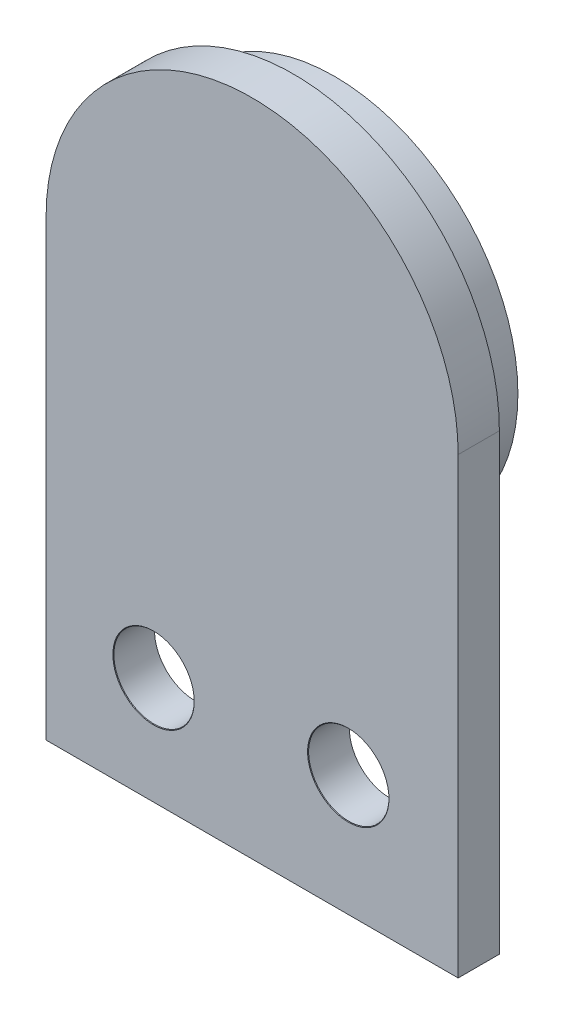
ISO-10303-21;
HEADER;
FILE_DESCRIPTION(('STEP AP214'),'2;1');
FILE_NAME('part.step','',(''),(''),'','','');
FILE_SCHEMA(('AUTOMOTIVE_DESIGN { 1 0 10303 214 1 1 1 1 }'));
ENDSEC;
DATA;
#1=APPLICATION_CONTEXT('core data for automotive mechanical design processes');
#2=APPLICATION_PROTOCOL_DEFINITION('international standard','automotive_design',2000,#1);
#3=PRODUCT_CONTEXT('',#1,'mechanical');
#4=PRODUCT('Part','Part','',(#3));
#5=PRODUCT_RELATED_PRODUCT_CATEGORY('part','',(#4));
#6=PRODUCT_DEFINITION_FORMATION('','',#4);
#7=PRODUCT_DEFINITION_CONTEXT('part definition',#1,'design');
#8=PRODUCT_DEFINITION('design','',#6,#7);
#9=PRODUCT_DEFINITION_SHAPE('','',#8);
#10=(LENGTH_UNIT() NAMED_UNIT(*) SI_UNIT(.MILLI.,.METRE.));
#11=(NAMED_UNIT(*) PLANE_ANGLE_UNIT() SI_UNIT($,.RADIAN.));
#12=(NAMED_UNIT(*) SI_UNIT($,.STERADIAN.) SOLID_ANGLE_UNIT());
#13=UNCERTAINTY_MEASURE_WITH_UNIT(LENGTH_MEASURE(1.E-05),#10,'distance_accuracy_value','');
#14=(GEOMETRIC_REPRESENTATION_CONTEXT(3) GLOBAL_UNCERTAINTY_ASSIGNED_CONTEXT((#13)) GLOBAL_UNIT_ASSIGNED_CONTEXT((#10,
#11,#12)) REPRESENTATION_CONTEXT('',''));
#15=CARTESIAN_POINT('',(0.,0.,0.));
#16=DIRECTION('',(0.,0.,1.));
#17=DIRECTION('',(1.,0.,0.));
#18=AXIS2_PLACEMENT_3D('',#15,#16,#17);
#19=CARTESIAN_POINT('',(0.,0.,2.));
#20=DIRECTION('',(0.,0.,-1.));
#21=DIRECTION('',(-1.,0.,0.));
#22=AXIS2_PLACEMENT_3D('',#19,#20,#21);
#23=CYLINDRICAL_SURFACE('',#22,10.);
#24=CARTESIAN_POINT('',(0.,0.,0.));
#25=DIRECTION('',(0.,0.,1.));
#26=DIRECTION('',(1.,0.,0.));
#27=AXIS2_PLACEMENT_3D('',#24,#25,#26);
#28=CIRCLE('',#27,10.);
#29=CARTESIAN_POINT('',(10.,0.,0.));
#30=VERTEX_POINT('',#29);
#31=CARTESIAN_POINT('',(-10.,0.,0.));
#32=VERTEX_POINT('',#31);
#33=EDGE_CURVE('E106',#30,#32,#28,.T.);
#34=ORIENTED_EDGE('',*,*,#33,.T.);
#35=DIRECTION('',(0.,0.,-1.));
#36=VECTOR('',#35,1.);
#37=CARTESIAN_POINT('',(-10.,0.,2.));
#38=LINE('',#37,#36);
#39=CARTESIAN_POINT('',(-10.,0.,2.));
#40=VERTEX_POINT('',#39);
#41=EDGE_CURVE('E97',#40,#32,#38,.T.);
#42=ORIENTED_EDGE('',*,*,#41,.F.);
#43=CARTESIAN_POINT('',(0.,0.,2.));
#44=DIRECTION('',(0.,0.,1.));
#45=DIRECTION('',(1.,0.,0.));
#46=AXIS2_PLACEMENT_3D('',#43,#44,#45);
#47=CIRCLE('',#46,10.);
#48=CARTESIAN_POINT('',(10.,0.,2.));
#49=VERTEX_POINT('',#48);
#50=EDGE_CURVE('E91',#49,#40,#47,.T.);
#51=ORIENTED_EDGE('',*,*,#50,.F.);
#52=DIRECTION('',(0.,0.,-1.));
#53=VECTOR('',#52,1.);
#54=CARTESIAN_POINT('',(10.,0.,2.));
#55=LINE('',#54,#53);
#56=EDGE_CURVE('E102',#49,#30,#55,.T.);
#57=ORIENTED_EDGE('',*,*,#56,.T.);
#58=EDGE_LOOP('',(#34,#42,#51,#57));
#59=FACE_BOUND('',#58,.T.);
#60=ADVANCED_FACE('F37',(#59),#23,.T.);
#61=CARTESIAN_POINT('',(-10.,0.,2.));
#62=DIRECTION('',(1.,0.,0.));
#63=DIRECTION('',(0.,0.,-1.));
#64=AXIS2_PLACEMENT_3D('',#61,#62,#63);
#65=PLANE('',#64);
#66=DIRECTION('',(0.,-1.,0.));
#67=VECTOR('',#66,1.);
#68=CARTESIAN_POINT('',(-10.,0.,0.));
#69=LINE('',#68,#67);
#70=CARTESIAN_POINT('',(-10.,-22.,0.));
#71=VERTEX_POINT('',#70);
#72=EDGE_CURVE('E96',#32,#71,#69,.T.);
#73=ORIENTED_EDGE('',*,*,#72,.T.);
#74=DIRECTION('',(0.,0.,-1.));
#75=VECTOR('',#74,1.);
#76=CARTESIAN_POINT('',(-10.,-22.,2.));
#77=LINE('',#76,#75);
#78=CARTESIAN_POINT('',(-10.,-22.,2.));
#79=VERTEX_POINT('',#78);
#80=EDGE_CURVE('E94',#79,#71,#77,.T.);
#81=ORIENTED_EDGE('',*,*,#80,.F.);
#82=DIRECTION('',(0.,-1.,0.));
#83=VECTOR('',#82,1.);
#84=CARTESIAN_POINT('',(-10.,0.,2.));
#85=LINE('',#84,#83);
#86=EDGE_CURVE('E86',#40,#79,#85,.T.);
#87=ORIENTED_EDGE('',*,*,#86,.F.);
#88=ORIENTED_EDGE('',*,*,#41,.T.);
#89=EDGE_LOOP('',(#73,#81,#87,#88));
#90=FACE_BOUND('',#89,.T.);
#91=ADVANCED_FACE('F95',(#90),#65,.F.);
#92=CARTESIAN_POINT('',(-10.,-22.,2.));
#93=DIRECTION('',(0.,1.,0.));
#94=DIRECTION('',(0.,0.,1.));
#95=AXIS2_PLACEMENT_3D('',#92,#93,#94);
#96=PLANE('',#95);
#97=DIRECTION('',(1.,0.,0.));
#98=VECTOR('',#97,1.);
#99=CARTESIAN_POINT('',(-10.,-22.,0.));
#100=LINE('',#99,#98);
#101=CARTESIAN_POINT('',(10.,-22.,0.));
#102=VERTEX_POINT('',#101);
#103=EDGE_CURVE('E72',#71,#102,#100,.T.);
#104=ORIENTED_EDGE('',*,*,#103,.T.);
#105=DIRECTION('',(0.,0.,-1.));
#106=VECTOR('',#105,1.);
#107=CARTESIAN_POINT('',(10.,-22.,2.));
#108=LINE('',#107,#106);
#109=CARTESIAN_POINT('',(10.,-22.,2.));
#110=VERTEX_POINT('',#109);
#111=EDGE_CURVE('E98',#110,#102,#108,.T.);
#112=ORIENTED_EDGE('',*,*,#111,.F.);
#113=DIRECTION('',(1.,0.,0.));
#114=VECTOR('',#113,1.);
#115=CARTESIAN_POINT('',(-10.,-22.,2.));
#116=LINE('',#115,#114);
#117=EDGE_CURVE('E89',#79,#110,#116,.T.);
#118=ORIENTED_EDGE('',*,*,#117,.F.);
#119=ORIENTED_EDGE('',*,*,#80,.T.);
#120=EDGE_LOOP('',(#104,#112,#118,#119));
#121=FACE_BOUND('',#120,.T.);
#122=ADVANCED_FACE('F100',(#121),#96,.F.);
#123=CARTESIAN_POINT('',(10.,-22.,2.));
#124=DIRECTION('',(-1.,0.,0.));
#125=DIRECTION('',(0.,0.,1.));
#126=AXIS2_PLACEMENT_3D('',#123,#124,#125);
#127=PLANE('',#126);
#128=DIRECTION('',(0.,1.,0.));
#129=VECTOR('',#128,1.);
#130=CARTESIAN_POINT('',(10.,-22.,0.));
#131=LINE('',#130,#129);
#132=EDGE_CURVE('E78',#102,#30,#131,.T.);
#133=ORIENTED_EDGE('',*,*,#132,.T.);
#134=ORIENTED_EDGE('',*,*,#56,.F.);
#135=DIRECTION('',(0.,1.,0.));
#136=VECTOR('',#135,1.);
#137=CARTESIAN_POINT('',(10.,-22.,2.));
#138=LINE('',#137,#136);
#139=EDGE_CURVE('E55',#110,#49,#138,.T.);
#140=ORIENTED_EDGE('',*,*,#139,.F.);
#141=ORIENTED_EDGE('',*,*,#111,.T.);
#142=EDGE_LOOP('',(#133,#134,#140,#141));
#143=FACE_BOUND('',#142,.T.);
#144=ADVANCED_FACE('F146',(#143),#127,.F.);
#145=CARTESIAN_POINT('',(0.,0.,2.));
#146=DIRECTION('',(0.,0.,1.));
#147=DIRECTION('',(1.,0.,0.));
#148=AXIS2_PLACEMENT_3D('',#145,#146,#147);
#149=PLANE('',#148);
#150=CARTESIAN_POINT('',(-4.78477952372158,-16.7810560178421,2.));
#151=DIRECTION('',(0.,0.,1.));
#152=DIRECTION('',(1.,0.,0.));
#153=AXIS2_PLACEMENT_3D('',#150,#151,#152);
#154=CIRCLE('',#153,1.975);
#155=CARTESIAN_POINT('',(-2.80977952372158,-16.7810560178421,2.));
#156=VERTEX_POINT('',#155);
#157=EDGE_CURVE('E304',#156,#156,#154,.T.);
#158=ORIENTED_EDGE('',*,*,#157,.F.);
#159=EDGE_LOOP('',(#158));
#160=FACE_BOUND('',#159,.T.);
#161=CARTESIAN_POINT('',(4.66729189929538,-16.1410173777661,2.));
#162=DIRECTION('',(0.,0.,1.));
#163=DIRECTION('',(1.,0.,0.));
#164=AXIS2_PLACEMENT_3D('',#161,#162,#163);
#165=CIRCLE('',#164,1.975);
#166=CARTESIAN_POINT('',(6.64229189929538,-16.1410173777661,2.));
#167=VERTEX_POINT('',#166);
#168=EDGE_CURVE('E124',#167,#167,#165,.T.);
#169=ORIENTED_EDGE('',*,*,#168,.F.);
#170=EDGE_LOOP('',(#169));
#171=FACE_BOUND('',#170,.T.);
#172=ORIENTED_EDGE('',*,*,#50,.T.);
#173=ORIENTED_EDGE('',*,*,#86,.T.);
#174=ORIENTED_EDGE('',*,*,#117,.T.);
#175=ORIENTED_EDGE('',*,*,#139,.T.);
#176=EDGE_LOOP('',(#172,#173,#174,#175));
#177=FACE_BOUND('',#176,.T.);
#178=ADVANCED_FACE('F87',(#160,#171,#177),#149,.T.);
#179=CARTESIAN_POINT('',(0.,0.,0.));
#180=DIRECTION('',(0.,0.,1.));
#181=DIRECTION('',(1.,0.,0.));
#182=AXIS2_PLACEMENT_3D('',#179,#180,#181);
#183=PLANE('',#182);
#184=CARTESIAN_POINT('',(-4.78477952372158,-16.7810560178421,0.));
#185=DIRECTION('',(0.,0.,1.));
#186=DIRECTION('',(1.,0.,0.));
#187=AXIS2_PLACEMENT_3D('',#184,#185,#186);
#188=CIRCLE('',#187,1.94999999999999);
#189=CARTESIAN_POINT('',(-2.83477952372159,-16.7810560178421,0.));
#190=VERTEX_POINT('',#189);
#191=EDGE_CURVE('E40',#190,#190,#188,.T.);
#192=ORIENTED_EDGE('',*,*,#191,.T.);
#193=EDGE_LOOP('',(#192));
#194=FACE_BOUND('',#193,.T.);
#195=CARTESIAN_POINT('',(4.66729189929538,-16.1410173777661,0.));
#196=DIRECTION('',(0.,0.,1.));
#197=DIRECTION('',(1.,0.,0.));
#198=AXIS2_PLACEMENT_3D('',#195,#196,#197);
#199=CIRCLE('',#198,1.94999999999999);
#200=CARTESIAN_POINT('',(6.61729189929537,-16.1410173777661,0.));
#201=VERTEX_POINT('',#200);
#202=EDGE_CURVE('E115',#201,#201,#199,.T.);
#203=ORIENTED_EDGE('',*,*,#202,.T.);
#204=EDGE_LOOP('',(#203));
#205=FACE_BOUND('',#204,.T.);
#206=CARTESIAN_POINT('',(0.,0.,0.));
#207=DIRECTION('',(0.,0.,-1.));
#208=DIRECTION('',(-1.,0.,0.));
#209=AXIS2_PLACEMENT_3D('',#206,#207,#208);
#210=CIRCLE('',#209,8.9);
#211=CARTESIAN_POINT('',(-8.9,0.,0.));
#212=VERTEX_POINT('',#211);
#213=EDGE_CURVE('E46',#212,#212,#210,.T.);
#214=ORIENTED_EDGE('',*,*,#213,.F.);
#215=EDGE_LOOP('',(#214));
#216=FACE_BOUND('',#215,.T.);
#217=ORIENTED_EDGE('',*,*,#33,.F.);
#218=ORIENTED_EDGE('',*,*,#132,.F.);
#219=ORIENTED_EDGE('',*,*,#103,.F.);
#220=ORIENTED_EDGE('',*,*,#72,.F.);
#221=EDGE_LOOP('',(#217,#218,#219,#220));
#222=FACE_BOUND('',#221,.T.);
#223=ADVANCED_FACE('F139',(#194,#205,#216,#222),#183,.F.);
#224=CARTESIAN_POINT('',(0.,0.,-2.));
#225=DIRECTION('',(0.,0.,1.));
#226=DIRECTION('',(1.,0.,0.));
#227=AXIS2_PLACEMENT_3D('',#224,#225,#226);
#228=CYLINDRICAL_SURFACE('',#227,8.9);
#229=CARTESIAN_POINT('',(0.,0.,-2.));
#230=DIRECTION('',(0.,0.,-1.));
#231=DIRECTION('',(-1.,0.,0.));
#232=AXIS2_PLACEMENT_3D('',#229,#230,#231);
#233=CIRCLE('',#232,8.9);
#234=CARTESIAN_POINT('',(-8.9,0.,-2.));
#235=VERTEX_POINT('',#234);
#236=EDGE_CURVE('E109',#235,#235,#233,.T.);
#237=ORIENTED_EDGE('',*,*,#236,.F.);
#238=EDGE_LOOP('',(#237));
#239=FACE_BOUND('',#238,.T.);
#240=ORIENTED_EDGE('',*,*,#213,.T.);
#241=EDGE_LOOP('',(#240));
#242=FACE_BOUND('',#241,.T.);
#243=ADVANCED_FACE('F137',(#239,#242),#228,.T.);
#244=CARTESIAN_POINT('',(0.,0.,-2.));
#245=DIRECTION('',(0.,0.,-1.));
#246=DIRECTION('',(-1.,0.,0.));
#247=AXIS2_PLACEMENT_3D('',#244,#245,#246);
#248=PLANE('',#247);
#249=CARTESIAN_POINT('',(0.,0.,-2.));
#250=DIRECTION('',(0.,0.,-1.));
#251=DIRECTION('',(-1.,0.,0.));
#252=AXIS2_PLACEMENT_3D('',#249,#250,#251);
#253=CIRCLE('',#252,2.);
#254=CARTESIAN_POINT('',(-2.,0.,-2.));
#255=VERTEX_POINT('',#254);
#256=EDGE_CURVE('E11',#255,#255,#253,.T.);
#257=ORIENTED_EDGE('',*,*,#256,.F.);
#258=EDGE_LOOP('',(#257));
#259=FACE_BOUND('',#258,.T.);
#260=ORIENTED_EDGE('',*,*,#236,.T.);
#261=EDGE_LOOP('',(#260));
#262=FACE_BOUND('',#261,.T.);
#263=ADVANCED_FACE('F182',(#259,#262),#248,.T.);
#264=CARTESIAN_POINT('',(0.,0.,-5.));
#265=DIRECTION('',(0.,0.,1.));
#266=DIRECTION('',(1.,0.,0.));
#267=AXIS2_PLACEMENT_3D('',#264,#265,#266);
#268=CYLINDRICAL_SURFACE('',#267,2.);
#269=CARTESIAN_POINT('',(0.,0.,-5.));
#270=DIRECTION('',(0.,0.,-1.));
#271=DIRECTION('',(-1.,0.,0.));
#272=AXIS2_PLACEMENT_3D('',#269,#270,#271);
#273=CIRCLE('',#272,2.);
#274=CARTESIAN_POINT('',(-2.,0.,-5.));
#275=VERTEX_POINT('',#274);
#276=EDGE_CURVE('E117',#275,#275,#273,.T.);
#277=ORIENTED_EDGE('',*,*,#276,.F.);
#278=EDGE_LOOP('',(#277));
#279=FACE_BOUND('',#278,.T.);
#280=ORIENTED_EDGE('',*,*,#256,.T.);
#281=EDGE_LOOP('',(#280));
#282=FACE_BOUND('',#281,.T.);
#283=ADVANCED_FACE('F194',(#279,#282),#268,.T.);
#284=CARTESIAN_POINT('',(0.,0.,-5.));
#285=DIRECTION('',(0.,0.,-1.));
#286=DIRECTION('',(-1.,0.,0.));
#287=AXIS2_PLACEMENT_3D('',#284,#285,#286);
#288=PLANE('',#287);
#289=ORIENTED_EDGE('',*,*,#276,.T.);
#290=EDGE_LOOP('',(#289));
#291=FACE_BOUND('',#290,.T.);
#292=ADVANCED_FACE('F205',(#291),#288,.T.);
#293=CARTESIAN_POINT('',(4.66729189929538,-16.1410173777661,2.));
#294=DIRECTION('',(0.,0.,1.));
#295=DIRECTION('',(1.,0.,0.));
#296=AXIS2_PLACEMENT_3D('',#293,#294,#295);
#297=CYLINDRICAL_SURFACE('',#296,1.94999999999999);
#298=CARTESIAN_POINT('',(4.66729189929538,-16.1410173777661,1.975));
#299=DIRECTION('',(0.,0.,1.));
#300=DIRECTION('',(1.,0.,0.));
#301=AXIS2_PLACEMENT_3D('',#298,#299,#300);
#302=CIRCLE('',#301,1.95);
#303=CARTESIAN_POINT('',(6.61729189929538,-16.1410173777661,1.975));
#304=VERTEX_POINT('',#303);
#305=EDGE_CURVE('E118',#304,#304,#302,.T.);
#306=ORIENTED_EDGE('',*,*,#305,.T.);
#307=EDGE_LOOP('',(#306));
#308=FACE_BOUND('',#307,.T.);
#309=ORIENTED_EDGE('',*,*,#202,.F.);
#310=EDGE_LOOP('',(#309));
#311=FACE_BOUND('',#310,.T.);
#312=ADVANCED_FACE('F216',(#308,#311),#297,.F.);
#313=CARTESIAN_POINT('',(4.66729189929538,-16.1410173777661,2.));
#314=DIRECTION('',(0.,0.,1.));
#315=DIRECTION('',(1.,0.,0.));
#316=AXIS2_PLACEMENT_3D('',#313,#314,#315);
#317=CONICAL_SURFACE('',#316,1.975,0.785398163397466);
#318=ORIENTED_EDGE('',*,*,#305,.F.);
#319=EDGE_LOOP('',(#318));
#320=FACE_BOUND('',#319,.T.);
#321=ORIENTED_EDGE('',*,*,#168,.T.);
#322=EDGE_LOOP('',(#321));
#323=FACE_BOUND('',#322,.T.);
#324=ADVANCED_FACE('F239',(#320,#323),#317,.F.);
#325=CARTESIAN_POINT('',(-4.78477952372158,-16.7810560178421,2.));
#326=DIRECTION('',(0.,0.,1.));
#327=DIRECTION('',(1.,0.,0.));
#328=AXIS2_PLACEMENT_3D('',#325,#326,#327);
#329=CYLINDRICAL_SURFACE('',#328,1.94999999999999);
#330=CARTESIAN_POINT('',(-4.78477952372158,-16.7810560178421,1.975));
#331=DIRECTION('',(0.,0.,1.));
#332=DIRECTION('',(1.,0.,0.));
#333=AXIS2_PLACEMENT_3D('',#330,#331,#332);
#334=CIRCLE('',#333,1.95);
#335=CARTESIAN_POINT('',(-2.83477952372158,-16.7810560178421,1.975));
#336=VERTEX_POINT('',#335);
#337=EDGE_CURVE('E301',#336,#336,#334,.T.);
#338=ORIENTED_EDGE('',*,*,#337,.T.);
#339=EDGE_LOOP('',(#338));
#340=FACE_BOUND('',#339,.T.);
#341=ORIENTED_EDGE('',*,*,#191,.F.);
#342=EDGE_LOOP('',(#341));
#343=FACE_BOUND('',#342,.T.);
#344=ADVANCED_FACE('F249',(#340,#343),#329,.F.);
#345=CARTESIAN_POINT('',(-4.78477952372158,-16.7810560178421,2.));
#346=DIRECTION('',(0.,0.,1.));
#347=DIRECTION('',(1.,0.,0.));
#348=AXIS2_PLACEMENT_3D('',#345,#346,#347);
#349=CONICAL_SURFACE('',#348,1.975,0.785398163397457);
#350=ORIENTED_EDGE('',*,*,#337,.F.);
#351=EDGE_LOOP('',(#350));
#352=FACE_BOUND('',#351,.T.);
#353=ORIENTED_EDGE('',*,*,#157,.T.);
#354=EDGE_LOOP('',(#353));
#355=FACE_BOUND('',#354,.T.);
#356=ADVANCED_FACE('F260',(#352,#355),#349,.F.);
#357=CLOSED_SHELL('',(#60,#91,#122,#144,#178,#223,#243,#263,#283,#292,#312,#324,#344,#356));
#358=MANIFOLD_SOLID_BREP('B2',#357);
#359=ADVANCED_BREP_SHAPE_REPRESENTATION('',(#18,#358),#14);
#360=SHAPE_DEFINITION_REPRESENTATION(#9,#359);
ENDSEC;
END-ISO-10303-21;
